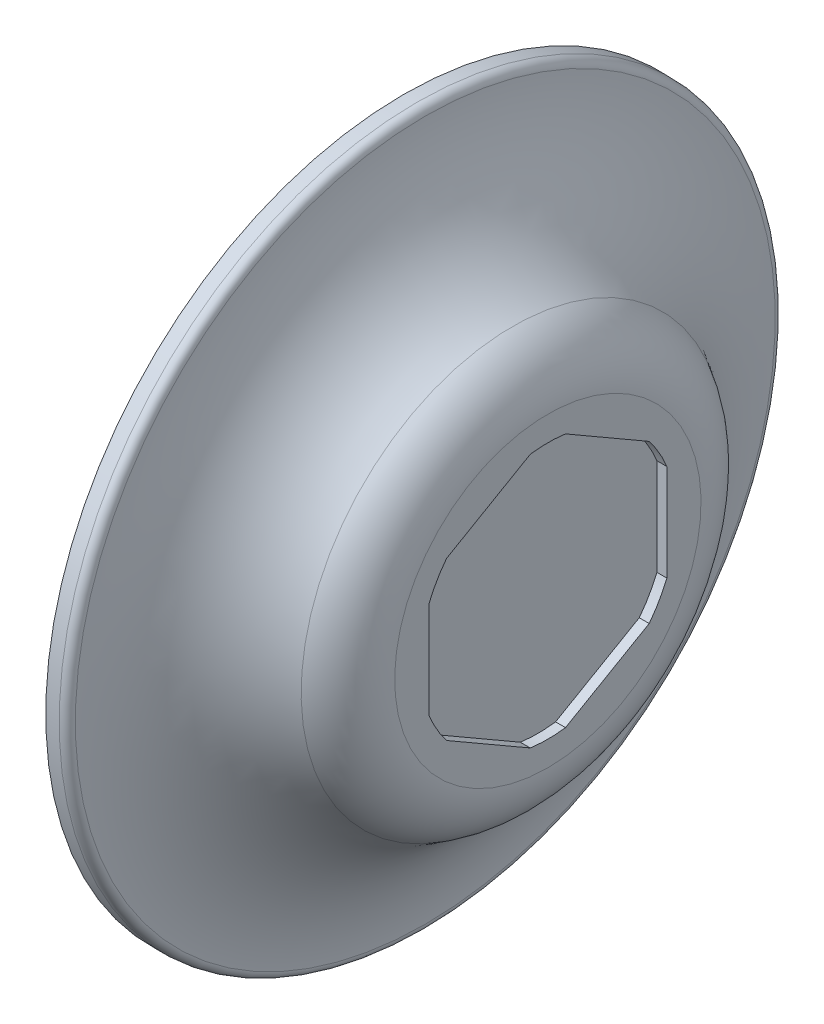
ISO-10303-21;
HEADER;
FILE_DESCRIPTION(('STEP AP214'),'2;1');
FILE_NAME('part.step','',(''),(''),'','','');
FILE_SCHEMA(('AUTOMOTIVE_DESIGN { 1 0 10303 214 1 1 1 1 }'));
ENDSEC;
DATA;
#1=APPLICATION_CONTEXT('core data for automotive mechanical design processes');
#2=APPLICATION_PROTOCOL_DEFINITION('international standard','automotive_design',2000,#1);
#3=PRODUCT_CONTEXT('',#1,'mechanical');
#4=PRODUCT('Part','Part','',(#3));
#5=PRODUCT_RELATED_PRODUCT_CATEGORY('part','',(#4));
#6=PRODUCT_DEFINITION_FORMATION('','',#4);
#7=PRODUCT_DEFINITION_CONTEXT('part definition',#1,'design');
#8=PRODUCT_DEFINITION('design','',#6,#7);
#9=PRODUCT_DEFINITION_SHAPE('','',#8);
#10=(LENGTH_UNIT() NAMED_UNIT(*) SI_UNIT(.MILLI.,.METRE.));
#11=(NAMED_UNIT(*) PLANE_ANGLE_UNIT() SI_UNIT($,.RADIAN.));
#12=(NAMED_UNIT(*) SI_UNIT($,.STERADIAN.) SOLID_ANGLE_UNIT());
#13=UNCERTAINTY_MEASURE_WITH_UNIT(LENGTH_MEASURE(1.E-05),#10,'distance_accuracy_value','');
#14=(GEOMETRIC_REPRESENTATION_CONTEXT(3) GLOBAL_UNCERTAINTY_ASSIGNED_CONTEXT((#13)) GLOBAL_UNIT_ASSIGNED_CONTEXT((#10,
#11,#12)) REPRESENTATION_CONTEXT('',''));
#15=CARTESIAN_POINT('',(0.,0.,0.));
#16=DIRECTION('',(0.,0.,1.));
#17=DIRECTION('',(1.,0.,0.));
#18=AXIS2_PLACEMENT_3D('',#15,#16,#17);
#19=CARTESIAN_POINT('',(6.94943478067401,0.,0.));
#20=DIRECTION('',(-1.,0.,0.));
#21=DIRECTION('',(0.,-1.,0.));
#22=AXIS2_PLACEMENT_3D('',#19,#20,#21);
#23=PLANE('',#22);
#24=CARTESIAN_POINT('',(6.94943478067401,0.,0.));
#25=DIRECTION('',(-1.,0.,0.));
#26=DIRECTION('',(0.,-1.,0.));
#27=AXIS2_PLACEMENT_3D('',#24,#25,#26);
#28=CIRCLE('',#27,12.2555);
#29=CARTESIAN_POINT('',(6.94943478067403,-12.2555,0.));
#30=VERTEX_POINT('',#29);
#31=EDGE_CURVE('E324',#30,#30,#28,.T.);
#32=ORIENTED_EDGE('',*,*,#31,.F.);
#33=EDGE_LOOP('',(#32));
#34=FACE_BOUND('',#33,.T.);
#35=CARTESIAN_POINT('',(6.94943478067403,0.,0.));
#36=DIRECTION('',(-1.,0.,0.));
#37=DIRECTION('',(0.,-1.,0.));
#38=AXIS2_PLACEMENT_3D('',#35,#36,#37);
#39=CIRCLE('',#38,15.5980272309643);
#40=CARTESIAN_POINT('',(6.94943478067407,-15.5980272309643,0.));
#41=VERTEX_POINT('',#40);
#42=EDGE_CURVE('E189',#41,#41,#39,.T.);
#43=ORIENTED_EDGE('',*,*,#42,.T.);
#44=EDGE_LOOP('',(#43));
#45=FACE_BOUND('',#44,.T.);
#46=ADVANCED_FACE('F34',(#34,#45),#23,.T.);
#47=CARTESIAN_POINT('',(9.413234780674,0.,0.));
#48=DIRECTION('',(-1.,0.,0.));
#49=DIRECTION('',(0.,-1.,0.));
#50=AXIS2_PLACEMENT_3D('',#47,#48,#49);
#51=PLANE('',#50);
#52=DIRECTION('',(0.,-0.500000000000011,-0.866025403784432));
#53=VECTOR('',#52,1.);
#54=CARTESIAN_POINT('',(9.41323478067401,-6.04451244070237,7.76779734572122));
#55=LINE('',#54,#53);
#56=CARTESIAN_POINT('',(9.41323478067401,-6.04451244070237,7.76779734572122));
#57=VERTEX_POINT('',#56);
#58=CARTESIAN_POINT('',(9.41323478067402,-9.74936605319513,1.35080265427886));
#59=VERTEX_POINT('',#58);
#60=EDGE_CURVE('E157',#57,#59,#55,.T.);
#61=ORIENTED_EDGE('',*,*,#60,.F.);
#62=CARTESIAN_POINT('',(9.413234780674,0.,0.));
#63=DIRECTION('',(1.,0.,0.));
#64=DIRECTION('',(0.,1.,0.));
#65=AXIS2_PLACEMENT_3D('',#62,#63,#64);
#66=CIRCLE('',#65,9.84249999999998);
#67=CARTESIAN_POINT('',(9.41323478067401,-3.70485361249268,9.1186));
#68=VERTEX_POINT('',#67);
#69=EDGE_CURVE('E49',#68,#57,#66,.T.);
#70=ORIENTED_EDGE('',*,*,#69,.F.);
#71=DIRECTION('',(0.,-1.,0.));
#72=VECTOR('',#71,1.);
#73=CARTESIAN_POINT('',(9.41323478067399,3.70485361249265,9.1186));
#74=LINE('',#73,#72);
#75=CARTESIAN_POINT('',(9.41323478067399,3.70485361249265,9.1186));
#76=VERTEX_POINT('',#75);
#77=EDGE_CURVE('E185',#76,#68,#74,.T.);
#78=ORIENTED_EDGE('',*,*,#77,.F.);
#79=CARTESIAN_POINT('',(9.413234780674,0.,0.));
#80=DIRECTION('',(1.,0.,0.));
#81=DIRECTION('',(0.,1.,0.));
#82=AXIS2_PLACEMENT_3D('',#79,#80,#81);
#83=CIRCLE('',#82,9.8425);
#84=CARTESIAN_POINT('',(9.41323478067399,6.04451244070241,7.76779734572122));
#85=VERTEX_POINT('',#84);
#86=EDGE_CURVE('E183',#85,#76,#83,.T.);
#87=ORIENTED_EDGE('',*,*,#86,.F.);
#88=DIRECTION('',(0.,0.499999999999997,-0.86602540378444));
#89=VECTOR('',#88,1.);
#90=CARTESIAN_POINT('',(9.41323478067399,6.04451244070241,7.76779734572122));
#91=LINE('',#90,#89);
#92=CARTESIAN_POINT('',(9.41323478067398,9.74936605319506,1.3508026542788));
#93=VERTEX_POINT('',#92);
#94=EDGE_CURVE('E131',#85,#93,#91,.T.);
#95=ORIENTED_EDGE('',*,*,#94,.T.);
#96=CARTESIAN_POINT('',(9.413234780674,0.,0.));
#97=DIRECTION('',(1.,0.,0.));
#98=DIRECTION('',(0.,1.,0.));
#99=AXIS2_PLACEMENT_3D('',#96,#97,#98);
#100=CIRCLE('',#99,9.84249999999996);
#101=CARTESIAN_POINT('',(9.41323478067398,9.74936605319506,-1.3508026542788));
#102=VERTEX_POINT('',#101);
#103=EDGE_CURVE('E179',#102,#93,#100,.T.);
#104=ORIENTED_EDGE('',*,*,#103,.F.);
#105=DIRECTION('',(0.,-0.499999999999997,-0.86602540378444));
#106=VECTOR('',#105,1.);
#107=CARTESIAN_POINT('',(9.41323478067398,9.74936605319506,-1.3508026542788));
#108=LINE('',#107,#106);
#109=CARTESIAN_POINT('',(9.41323478067399,6.04451244070241,-7.76779734572122));
#110=VERTEX_POINT('',#109);
#111=EDGE_CURVE('E176',#102,#110,#108,.T.);
#112=ORIENTED_EDGE('',*,*,#111,.T.);
#113=CARTESIAN_POINT('',(9.413234780674,0.,0.));
#114=DIRECTION('',(1.,0.,0.));
#115=DIRECTION('',(0.,1.,0.));
#116=AXIS2_PLACEMENT_3D('',#113,#114,#115);
#117=CIRCLE('',#116,9.8425);
#118=CARTESIAN_POINT('',(9.41323478067399,3.70485361249266,-9.1186));
#119=VERTEX_POINT('',#118);
#120=EDGE_CURVE('E173',#119,#110,#117,.T.);
#121=ORIENTED_EDGE('',*,*,#120,.F.);
#122=DIRECTION('',(0.,-1.,0.));
#123=VECTOR('',#122,1.);
#124=CARTESIAN_POINT('',(9.41323478067399,3.70485361249266,-9.1186));
#125=LINE('',#124,#123);
#126=CARTESIAN_POINT('',(9.41323478067401,-3.70485361249268,-9.11859999999998));
#127=VERTEX_POINT('',#126);
#128=EDGE_CURVE('E170',#119,#127,#125,.T.);
#129=ORIENTED_EDGE('',*,*,#128,.T.);
#130=CARTESIAN_POINT('',(9.413234780674,0.,0.));
#131=DIRECTION('',(1.,0.,0.));
#132=DIRECTION('',(0.,1.,0.));
#133=AXIS2_PLACEMENT_3D('',#130,#131,#132);
#134=CIRCLE('',#133,9.84249999999998);
#135=CARTESIAN_POINT('',(9.41323478067401,-6.04451244070237,-7.76779734572122));
#136=VERTEX_POINT('',#135);
#137=EDGE_CURVE('E167',#136,#127,#134,.T.);
#138=ORIENTED_EDGE('',*,*,#137,.F.);
#139=DIRECTION('',(0.,0.500000000000011,-0.866025403784432));
#140=VECTOR('',#139,1.);
#141=CARTESIAN_POINT('',(9.41323478067402,-9.74936605319513,-1.35080265427886));
#142=LINE('',#141,#140);
#143=CARTESIAN_POINT('',(9.41323478067402,-9.74936605319513,-1.35080265427886));
#144=VERTEX_POINT('',#143);
#145=EDGE_CURVE('E164',#144,#136,#142,.T.);
#146=ORIENTED_EDGE('',*,*,#145,.F.);
#147=CARTESIAN_POINT('',(9.413234780674,0.,0.));
#148=DIRECTION('',(1.,0.,0.));
#149=DIRECTION('',(0.,1.,0.));
#150=AXIS2_PLACEMENT_3D('',#147,#148,#149);
#151=CIRCLE('',#150,9.8425);
#152=EDGE_CURVE('E161',#59,#144,#151,.T.);
#153=ORIENTED_EDGE('',*,*,#152,.F.);
#154=EDGE_LOOP('',(#61,#70,#78,#87,#95,#104,#112,#121,#129,#138,#146,#153));
#155=FACE_BOUND('',#154,.T.);
#156=CARTESIAN_POINT('',(9.41323478067402,0.,0.));
#157=DIRECTION('',(-1.,0.,0.));
#158=DIRECTION('',(0.,-1.,0.));
#159=AXIS2_PLACEMENT_3D('',#156,#157,#158);
#160=CIRCLE('',#159,11.7436081205027);
#161=CARTESIAN_POINT('',(9.41323478067404,-11.7436081205027,0.));
#162=VERTEX_POINT('',#161);
#163=EDGE_CURVE('E221',#162,#162,#160,.T.);
#164=ORIENTED_EDGE('',*,*,#163,.F.);
#165=EDGE_LOOP('',(#164));
#166=FACE_BOUND('',#165,.T.);
#167=ADVANCED_FACE('F240',(#155,#166),#51,.F.);
#168=CARTESIAN_POINT('',(4.33323478067402,0.,0.));
#169=DIRECTION('',(-1.,0.,0.));
#170=DIRECTION('',(0.,-1.,0.));
#171=AXIS2_PLACEMENT_3D('',#168,#169,#170);
#172=TOROIDAL_SURFACE('',#171,11.7436081205027,5.08);
#173=CARTESIAN_POINT('',(6.7237391290529,0.,0.));
#174=DIRECTION('',(-1.,0.,0.));
#175=DIRECTION('',(0.,-1.,0.));
#176=AXIS2_PLACEMENT_3D('',#173,#174,#175);
#177=CIRCLE('',#176,16.2260058003591);
#178=CARTESIAN_POINT('',(6.72373912905293,-16.2260058003591,0.));
#179=VERTEX_POINT('',#178);
#180=EDGE_CURVE('E218',#179,#179,#177,.T.);
#181=ORIENTED_EDGE('',*,*,#180,.F.);
#182=EDGE_LOOP('',(#181));
#183=FACE_BOUND('',#182,.T.);
#184=ORIENTED_EDGE('',*,*,#163,.T.);
#185=EDGE_LOOP('',(#184));
#186=FACE_BOUND('',#185,.T.);
#187=ADVANCED_FACE('F245',(#183,#186),#172,.T.);
#188=CARTESIAN_POINT('',(12.7000000000001,0.,0.));
#189=DIRECTION('',(-1.,0.,0.));
#190=DIRECTION('',(0.,-1.,0.));
#191=AXIS2_PLACEMENT_3D('',#188,#189,#190);
#192=TOROIDAL_SURFACE('',#191,27.432,12.7);
#193=CARTESIAN_POINT('',(0.0144072649953912,0.,0.));
#194=DIRECTION('',(1.,0.,0.));
#195=DIRECTION('',(0.,1.,0.));
#196=AXIS2_PLACEMENT_3D('',#193,#194,#195);
#197=CIRCLE('',#196,26.8272380952384);
#198=CARTESIAN_POINT('',(0.0144072649953379,26.8272380952384,0.));
#199=VERTEX_POINT('',#198);
#200=EDGE_CURVE('E11',#199,#199,#197,.T.);
#201=ORIENTED_EDGE('',*,*,#200,.T.);
#202=EDGE_LOOP('',(#201));
#203=FACE_BOUND('',#202,.T.);
#204=ORIENTED_EDGE('',*,*,#180,.T.);
#205=EDGE_LOOP('',(#204));
#206=FACE_BOUND('',#205,.T.);
#207=ADVANCED_FACE('F253',(#203,#206),#192,.F.);
#208=CARTESIAN_POINT('',(6.94943478067398,0.,0.));
#209=DIRECTION('',(-1.,0.,0.));
#210=DIRECTION('',(0.,-1.,0.));
#211=AXIS2_PLACEMENT_3D('',#208,#209,#210);
#212=CYLINDRICAL_SURFACE('',#211,27.432);
#213=CARTESIAN_POINT('',(-0.619872371760822,0.,0.));
#214=DIRECTION('',(1.,0.,0.));
#215=DIRECTION('',(0.,1.,0.));
#216=AXIS2_PLACEMENT_3D('',#213,#214,#215);
#217=CIRCLE('',#216,27.432);
#218=CARTESIAN_POINT('',(-0.619872371760877,27.432,0.));
#219=VERTEX_POINT('',#218);
#220=EDGE_CURVE('E42',#219,#219,#217,.F.);
#221=ORIENTED_EDGE('',*,*,#220,.T.);
#222=EDGE_LOOP('',(#221));
#223=FACE_BOUND('',#222,.T.);
#224=CARTESIAN_POINT('',(-1.6509999999999,0.,0.));
#225=DIRECTION('',(-1.,0.,0.));
#226=DIRECTION('',(0.,-1.,0.));
#227=AXIS2_PLACEMENT_3D('',#224,#225,#226);
#228=CIRCLE('',#227,27.432);
#229=CARTESIAN_POINT('',(-1.65099999999984,-27.4320000000001,0.));
#230=VERTEX_POINT('',#229);
#231=EDGE_CURVE('E215',#230,#230,#228,.T.);
#232=ORIENTED_EDGE('',*,*,#231,.F.);
#233=EDGE_LOOP('',(#232));
#234=FACE_BOUND('',#233,.T.);
#235=ADVANCED_FACE('F226',(#223,#234),#212,.T.);
#236=CARTESIAN_POINT('',(-1.65099999999995,27.432,0.));
#237=DIRECTION('',(1.,0.,0.));
#238=DIRECTION('',(0.,1.,0.));
#239=AXIS2_PLACEMENT_3D('',#236,#237,#238);
#240=PLANE('',#239);
#241=CARTESIAN_POINT('',(-1.6509999999999,0.,0.));
#242=DIRECTION('',(-1.,0.,0.));
#243=DIRECTION('',(0.,-1.,0.));
#244=AXIS2_PLACEMENT_3D('',#241,#242,#243);
#245=CIRCLE('',#244,26.162);
#246=CARTESIAN_POINT('',(-1.65099999999985,-26.1620000000001,0.));
#247=VERTEX_POINT('',#246);
#248=EDGE_CURVE('E212',#247,#247,#245,.T.);
#249=ORIENTED_EDGE('',*,*,#248,.F.);
#250=EDGE_LOOP('',(#249));
#251=FACE_BOUND('',#250,.T.);
#252=ORIENTED_EDGE('',*,*,#231,.T.);
#253=EDGE_LOOP('',(#252));
#254=FACE_BOUND('',#253,.T.);
#255=ADVANCED_FACE('F260',(#251,#254),#240,.F.);
#256=CARTESIAN_POINT('',(6.94943478067398,0.,0.));
#257=DIRECTION('',(-1.,0.,0.));
#258=DIRECTION('',(0.,-1.,0.));
#259=AXIS2_PLACEMENT_3D('',#256,#257,#258);
#260=CYLINDRICAL_SURFACE('',#259,26.162);
#261=CARTESIAN_POINT('',(-0.395763125530236,0.,0.));
#262=DIRECTION('',(-1.,0.,0.));
#263=DIRECTION('',(0.,-1.,0.));
#264=AXIS2_PLACEMENT_3D('',#261,#262,#263);
#265=CIRCLE('',#264,26.162);
#266=CARTESIAN_POINT('',(-0.395763125530184,-26.1620000000001,0.));
#267=VERTEX_POINT('',#266);
#268=EDGE_CURVE('E209',#267,#267,#265,.T.);
#269=ORIENTED_EDGE('',*,*,#268,.F.);
#270=EDGE_LOOP('',(#269));
#271=FACE_BOUND('',#270,.T.);
#272=ORIENTED_EDGE('',*,*,#248,.T.);
#273=EDGE_LOOP('',(#272));
#274=FACE_BOUND('',#273,.T.);
#275=ADVANCED_FACE('F263',(#271,#274),#260,.F.);
#276=CARTESIAN_POINT('',(12.7000000000001,0.,0.));
#277=DIRECTION('',(-1.,0.,0.));
#278=DIRECTION('',(0.,-1.,0.));
#279=AXIS2_PLACEMENT_3D('',#276,#277,#278);
#280=TOROIDAL_SURFACE('',#279,27.432,13.1572);
#281=ORIENTED_EDGE('',*,*,#42,.F.);
#282=EDGE_LOOP('',(#281));
#283=FACE_BOUND('',#282,.T.);
#284=ORIENTED_EDGE('',*,*,#268,.T.);
#285=EDGE_LOOP('',(#284));
#286=FACE_BOUND('',#285,.T.);
#287=ADVANCED_FACE('F267',(#283,#286),#280,.T.);
#288=CARTESIAN_POINT('',(8.651234780674,0.,0.));
#289=DIRECTION('',(1.,0.,0.));
#290=DIRECTION('',(0.,1.,0.));
#291=AXIS2_PLACEMENT_3D('',#288,#289,#290);
#292=CYLINDRICAL_SURFACE('',#291,9.84249999999998);
#293=ORIENTED_EDGE('',*,*,#69,.T.);
#294=DIRECTION('',(1.,0.,0.));
#295=VECTOR('',#294,1.);
#296=CARTESIAN_POINT('',(8.65123478067401,-6.04451244070238,7.76779734572122));
#297=LINE('',#296,#295);
#298=CARTESIAN_POINT('',(8.65123478067401,-6.04451244070238,7.76779734572122));
#299=VERTEX_POINT('',#298);
#300=EDGE_CURVE('E97',#299,#57,#297,.T.);
#301=ORIENTED_EDGE('',*,*,#300,.F.);
#302=CARTESIAN_POINT('',(8.651234780674,0.,0.));
#303=DIRECTION('',(1.,0.,0.));
#304=DIRECTION('',(0.,1.,0.));
#305=AXIS2_PLACEMENT_3D('',#302,#303,#304);
#306=CIRCLE('',#305,9.84249999999998);
#307=CARTESIAN_POINT('',(8.65123478067401,-3.70485361249268,9.1186));
#308=VERTEX_POINT('',#307);
#309=EDGE_CURVE('E187',#308,#299,#306,.T.);
#310=ORIENTED_EDGE('',*,*,#309,.F.);
#311=DIRECTION('',(1.,0.,0.));
#312=VECTOR('',#311,1.);
#313=CARTESIAN_POINT('',(8.65123478067401,-3.70485361249268,9.1186));
#314=LINE('',#313,#312);
#315=EDGE_CURVE('E57',#308,#68,#314,.T.);
#316=ORIENTED_EDGE('',*,*,#315,.T.);
#317=EDGE_LOOP('',(#293,#301,#310,#316));
#318=FACE_BOUND('',#317,.T.);
#319=ADVANCED_FACE('F271',(#318),#292,.F.);
#320=CARTESIAN_POINT('',(8.65123478067399,3.70485361249265,9.1186));
#321=DIRECTION('',(0.,0.,1.));
#322=DIRECTION('',(1.,0.,0.));
#323=AXIS2_PLACEMENT_3D('',#320,#321,#322);
#324=PLANE('',#323);
#325=ORIENTED_EDGE('',*,*,#77,.T.);
#326=ORIENTED_EDGE('',*,*,#315,.F.);
#327=DIRECTION('',(0.,-1.,0.));
#328=VECTOR('',#327,1.);
#329=CARTESIAN_POINT('',(8.65123478067399,3.70485361249265,9.1186));
#330=LINE('',#329,#328);
#331=CARTESIAN_POINT('',(8.65123478067399,3.70485361249265,9.1186));
#332=VERTEX_POINT('',#331);
#333=EDGE_CURVE('E151',#332,#308,#330,.T.);
#334=ORIENTED_EDGE('',*,*,#333,.F.);
#335=DIRECTION('',(1.,0.,0.));
#336=VECTOR('',#335,1.);
#337=CARTESIAN_POINT('',(8.65123478067399,3.70485361249265,9.1186));
#338=LINE('',#337,#336);
#339=EDGE_CURVE('E136',#332,#76,#338,.T.);
#340=ORIENTED_EDGE('',*,*,#339,.T.);
#341=EDGE_LOOP('',(#325,#326,#334,#340));
#342=FACE_BOUND('',#341,.T.);
#343=ADVANCED_FACE('F275',(#342),#324,.F.);
#344=CARTESIAN_POINT('',(8.651234780674,0.,0.));
#345=DIRECTION('',(1.,0.,0.));
#346=DIRECTION('',(0.,1.,0.));
#347=AXIS2_PLACEMENT_3D('',#344,#345,#346);
#348=CYLINDRICAL_SURFACE('',#347,9.8425);
#349=ORIENTED_EDGE('',*,*,#86,.T.);
#350=ORIENTED_EDGE('',*,*,#339,.F.);
#351=CARTESIAN_POINT('',(8.651234780674,0.,0.));
#352=DIRECTION('',(1.,0.,0.));
#353=DIRECTION('',(0.,1.,0.));
#354=AXIS2_PLACEMENT_3D('',#351,#352,#353);
#355=CIRCLE('',#354,9.8425);
#356=CARTESIAN_POINT('',(8.65123478067399,6.04451244070241,7.76779734572122));
#357=VERTEX_POINT('',#356);
#358=EDGE_CURVE('E145',#357,#332,#355,.T.);
#359=ORIENTED_EDGE('',*,*,#358,.F.);
#360=DIRECTION('',(1.,0.,0.));
#361=VECTOR('',#360,1.);
#362=CARTESIAN_POINT('',(8.65123478067399,6.04451244070241,7.76779734572122));
#363=LINE('',#362,#361);
#364=EDGE_CURVE('E125',#357,#85,#363,.T.);
#365=ORIENTED_EDGE('',*,*,#364,.T.);
#366=EDGE_LOOP('',(#349,#350,#359,#365));
#367=FACE_BOUND('',#366,.T.);
#368=ADVANCED_FACE('F150',(#367),#348,.F.);
#369=CARTESIAN_POINT('',(8.65123478067399,6.04451244070241,7.76779734572122));
#370=DIRECTION('',(0.,-0.86602540378444,-0.499999999999997));
#371=DIRECTION('',(0.,0.499999999999997,-0.86602540378444));
#372=AXIS2_PLACEMENT_3D('',#369,#370,#371);
#373=PLANE('',#372);
#374=ORIENTED_EDGE('',*,*,#94,.F.);
#375=ORIENTED_EDGE('',*,*,#364,.F.);
#376=DIRECTION('',(0.,0.499999999999997,-0.86602540378444));
#377=VECTOR('',#376,1.);
#378=CARTESIAN_POINT('',(8.65123478067399,6.04451244070241,7.76779734572122));
#379=LINE('',#378,#377);
#380=CARTESIAN_POINT('',(8.65123478067398,9.74936605319506,1.3508026542788));
#381=VERTEX_POINT('',#380);
#382=EDGE_CURVE('E128',#357,#381,#379,.T.);
#383=ORIENTED_EDGE('',*,*,#382,.T.);
#384=DIRECTION('',(1.,0.,0.));
#385=VECTOR('',#384,1.);
#386=CARTESIAN_POINT('',(8.65123478067398,9.74936605319506,1.3508026542788));
#387=LINE('',#386,#385);
#388=EDGE_CURVE('E137',#381,#93,#387,.T.);
#389=ORIENTED_EDGE('',*,*,#388,.T.);
#390=EDGE_LOOP('',(#374,#375,#383,#389));
#391=FACE_BOUND('',#390,.T.);
#392=ADVANCED_FACE('F127',(#391),#373,.T.);
#393=CARTESIAN_POINT('',(8.651234780674,0.,0.));
#394=DIRECTION('',(1.,0.,0.));
#395=DIRECTION('',(0.,1.,0.));
#396=AXIS2_PLACEMENT_3D('',#393,#394,#395);
#397=CYLINDRICAL_SURFACE('',#396,9.84249999999996);
#398=ORIENTED_EDGE('',*,*,#103,.T.);
#399=ORIENTED_EDGE('',*,*,#388,.F.);
#400=CARTESIAN_POINT('',(8.651234780674,0.,0.));
#401=DIRECTION('',(1.,0.,0.));
#402=DIRECTION('',(0.,1.,0.));
#403=AXIS2_PLACEMENT_3D('',#400,#401,#402);
#404=CIRCLE('',#403,9.84249999999996);
#405=CARTESIAN_POINT('',(8.65123478067398,9.74936605319506,-1.3508026542788));
#406=VERTEX_POINT('',#405);
#407=EDGE_CURVE('E148',#406,#381,#404,.T.);
#408=ORIENTED_EDGE('',*,*,#407,.F.);
#409=DIRECTION('',(1.,0.,0.));
#410=VECTOR('',#409,1.);
#411=CARTESIAN_POINT('',(8.65123478067398,9.74936605319506,-1.3508026542788));
#412=LINE('',#411,#410);
#413=EDGE_CURVE('E192',#406,#102,#412,.T.);
#414=ORIENTED_EDGE('',*,*,#413,.T.);
#415=EDGE_LOOP('',(#398,#399,#408,#414));
#416=FACE_BOUND('',#415,.T.);
#417=ADVANCED_FACE('F303',(#416),#397,.F.);
#418=CARTESIAN_POINT('',(8.65123478067398,9.74936605319506,-1.3508026542788));
#419=DIRECTION('',(0.,-0.86602540378444,0.499999999999997));
#420=DIRECTION('',(0.,-0.499999999999997,-0.86602540378444));
#421=AXIS2_PLACEMENT_3D('',#418,#419,#420);
#422=PLANE('',#421);
#423=ORIENTED_EDGE('',*,*,#111,.F.);
#424=ORIENTED_EDGE('',*,*,#413,.F.);
#425=DIRECTION('',(0.,-0.499999999999997,-0.86602540378444));
#426=VECTOR('',#425,1.);
#427=CARTESIAN_POINT('',(8.65123478067398,9.74936605319506,-1.3508026542788));
#428=LINE('',#427,#426);
#429=CARTESIAN_POINT('',(8.65123478067399,6.04451244070241,-7.76779734572122));
#430=VERTEX_POINT('',#429);
#431=EDGE_CURVE('E346',#406,#430,#428,.T.);
#432=ORIENTED_EDGE('',*,*,#431,.T.);
#433=DIRECTION('',(1.,0.,0.));
#434=VECTOR('',#433,1.);
#435=CARTESIAN_POINT('',(8.65123478067399,6.04451244070241,-7.76779734572122));
#436=LINE('',#435,#434);
#437=EDGE_CURVE('E194',#430,#110,#436,.T.);
#438=ORIENTED_EDGE('',*,*,#437,.T.);
#439=EDGE_LOOP('',(#423,#424,#432,#438));
#440=FACE_BOUND('',#439,.T.);
#441=ADVANCED_FACE('F299',(#440),#422,.T.);
#442=CARTESIAN_POINT('',(8.651234780674,0.,0.));
#443=DIRECTION('',(1.,0.,0.));
#444=DIRECTION('',(0.,1.,0.));
#445=AXIS2_PLACEMENT_3D('',#442,#443,#444);
#446=CYLINDRICAL_SURFACE('',#445,9.8425);
#447=ORIENTED_EDGE('',*,*,#120,.T.);
#448=ORIENTED_EDGE('',*,*,#437,.F.);
#449=CARTESIAN_POINT('',(8.651234780674,0.,0.));
#450=DIRECTION('',(1.,0.,0.));
#451=DIRECTION('',(0.,1.,0.));
#452=AXIS2_PLACEMENT_3D('',#449,#450,#451);
#453=CIRCLE('',#452,9.8425);
#454=CARTESIAN_POINT('',(8.65123478067399,3.70485361249266,-9.1186));
#455=VERTEX_POINT('',#454);
#456=EDGE_CURVE('E343',#455,#430,#453,.T.);
#457=ORIENTED_EDGE('',*,*,#456,.F.);
#458=DIRECTION('',(1.,0.,0.));
#459=VECTOR('',#458,1.);
#460=CARTESIAN_POINT('',(8.65123478067399,3.70485361249266,-9.1186));
#461=LINE('',#460,#459);
#462=EDGE_CURVE('E196',#455,#119,#461,.T.);
#463=ORIENTED_EDGE('',*,*,#462,.T.);
#464=EDGE_LOOP('',(#447,#448,#457,#463));
#465=FACE_BOUND('',#464,.T.);
#466=ADVANCED_FACE('F295',(#465),#446,.F.);
#467=CARTESIAN_POINT('',(8.65123478067399,3.70485361249266,-9.1186));
#468=DIRECTION('',(0.,0.,1.));
#469=DIRECTION('',(1.,0.,0.));
#470=AXIS2_PLACEMENT_3D('',#467,#468,#469);
#471=PLANE('',#470);
#472=ORIENTED_EDGE('',*,*,#128,.F.);
#473=ORIENTED_EDGE('',*,*,#462,.F.);
#474=DIRECTION('',(0.,-1.,0.));
#475=VECTOR('',#474,1.);
#476=CARTESIAN_POINT('',(8.65123478067399,3.70485361249266,-9.1186));
#477=LINE('',#476,#475);
#478=CARTESIAN_POINT('',(8.65123478067401,-3.70485361249269,-9.11859999999998));
#479=VERTEX_POINT('',#478);
#480=EDGE_CURVE('E341',#455,#479,#477,.T.);
#481=ORIENTED_EDGE('',*,*,#480,.T.);
#482=DIRECTION('',(1.,0.,0.));
#483=VECTOR('',#482,1.);
#484=CARTESIAN_POINT('',(8.65123478067401,-3.70485361249269,-9.11859999999998));
#485=LINE('',#484,#483);
#486=EDGE_CURVE('E198',#479,#127,#485,.T.);
#487=ORIENTED_EDGE('',*,*,#486,.T.);
#488=EDGE_LOOP('',(#472,#473,#481,#487));
#489=FACE_BOUND('',#488,.T.);
#490=ADVANCED_FACE('F291',(#489),#471,.T.);
#491=CARTESIAN_POINT('',(8.651234780674,0.,0.));
#492=DIRECTION('',(1.,0.,0.));
#493=DIRECTION('',(0.,1.,0.));
#494=AXIS2_PLACEMENT_3D('',#491,#492,#493);
#495=CYLINDRICAL_SURFACE('',#494,9.84249999999998);
#496=ORIENTED_EDGE('',*,*,#137,.T.);
#497=ORIENTED_EDGE('',*,*,#486,.F.);
#498=CARTESIAN_POINT('',(8.651234780674,0.,0.));
#499=DIRECTION('',(1.,0.,0.));
#500=DIRECTION('',(0.,1.,0.));
#501=AXIS2_PLACEMENT_3D('',#498,#499,#500);
#502=CIRCLE('',#501,9.84249999999998);
#503=CARTESIAN_POINT('',(8.65123478067401,-6.04451244070237,-7.76779734572122));
#504=VERTEX_POINT('',#503);
#505=EDGE_CURVE('E338',#504,#479,#502,.T.);
#506=ORIENTED_EDGE('',*,*,#505,.F.);
#507=DIRECTION('',(1.,0.,0.));
#508=VECTOR('',#507,1.);
#509=CARTESIAN_POINT('',(8.65123478067401,-6.04451244070237,-7.76779734572122));
#510=LINE('',#509,#508);
#511=EDGE_CURVE('E200',#504,#136,#510,.T.);
#512=ORIENTED_EDGE('',*,*,#511,.T.);
#513=EDGE_LOOP('',(#496,#497,#506,#512));
#514=FACE_BOUND('',#513,.T.);
#515=ADVANCED_FACE('F287',(#514),#495,.F.);
#516=CARTESIAN_POINT('',(8.65123478067402,-9.74936605319513,-1.35080265427886));
#517=DIRECTION('',(0.,-0.866025403784432,-0.500000000000011));
#518=DIRECTION('',(0.,0.500000000000012,-0.866025403784432));
#519=AXIS2_PLACEMENT_3D('',#516,#517,#518);
#520=PLANE('',#519);
#521=ORIENTED_EDGE('',*,*,#145,.T.);
#522=ORIENTED_EDGE('',*,*,#511,.F.);
#523=DIRECTION('',(0.,0.500000000000011,-0.866025403784432));
#524=VECTOR('',#523,1.);
#525=CARTESIAN_POINT('',(8.65123478067402,-9.74936605319513,-1.35080265427886));
#526=LINE('',#525,#524);
#527=CARTESIAN_POINT('',(8.65123478067402,-9.74936605319513,-1.35080265427886));
#528=VERTEX_POINT('',#527);
#529=EDGE_CURVE('E335',#528,#504,#526,.T.);
#530=ORIENTED_EDGE('',*,*,#529,.F.);
#531=DIRECTION('',(1.,0.,0.));
#532=VECTOR('',#531,1.);
#533=CARTESIAN_POINT('',(8.65123478067402,-9.74936605319513,-1.35080265427886));
#534=LINE('',#533,#532);
#535=EDGE_CURVE('E202',#528,#144,#534,.T.);
#536=ORIENTED_EDGE('',*,*,#535,.T.);
#537=EDGE_LOOP('',(#521,#522,#530,#536));
#538=FACE_BOUND('',#537,.T.);
#539=ADVANCED_FACE('F283',(#538),#520,.F.);
#540=CARTESIAN_POINT('',(8.651234780674,0.,0.));
#541=DIRECTION('',(1.,0.,0.));
#542=DIRECTION('',(0.,1.,0.));
#543=AXIS2_PLACEMENT_3D('',#540,#541,#542);
#544=CYLINDRICAL_SURFACE('',#543,9.8425);
#545=ORIENTED_EDGE('',*,*,#152,.T.);
#546=ORIENTED_EDGE('',*,*,#535,.F.);
#547=CARTESIAN_POINT('',(8.651234780674,0.,0.));
#548=DIRECTION('',(1.,0.,0.));
#549=DIRECTION('',(0.,1.,0.));
#550=AXIS2_PLACEMENT_3D('',#547,#548,#549);
#551=CIRCLE('',#550,9.8425);
#552=CARTESIAN_POINT('',(8.65123478067402,-9.74936605319513,1.35080265427886));
#553=VERTEX_POINT('',#552);
#554=EDGE_CURVE('E332',#553,#528,#551,.T.);
#555=ORIENTED_EDGE('',*,*,#554,.F.);
#556=DIRECTION('',(1.,0.,0.));
#557=VECTOR('',#556,1.);
#558=CARTESIAN_POINT('',(8.65123478067402,-9.74936605319513,1.35080265427886));
#559=LINE('',#558,#557);
#560=EDGE_CURVE('E204',#553,#59,#559,.T.);
#561=ORIENTED_EDGE('',*,*,#560,.T.);
#562=EDGE_LOOP('',(#545,#546,#555,#561));
#563=FACE_BOUND('',#562,.T.);
#564=ADVANCED_FACE('F279',(#563),#544,.F.);
#565=CARTESIAN_POINT('',(8.65123478067401,-6.04451244070238,7.76779734572122));
#566=DIRECTION('',(0.,-0.866025403784432,0.500000000000011));
#567=DIRECTION('',(0.,-0.500000000000011,-0.866025403784432));
#568=AXIS2_PLACEMENT_3D('',#565,#566,#567);
#569=PLANE('',#568);
#570=ORIENTED_EDGE('',*,*,#60,.T.);
#571=ORIENTED_EDGE('',*,*,#560,.F.);
#572=DIRECTION('',(0.,-0.500000000000011,-0.866025403784432));
#573=VECTOR('',#572,1.);
#574=CARTESIAN_POINT('',(8.65123478067401,-6.04451244070238,7.76779734572122));
#575=LINE('',#574,#573);
#576=EDGE_CURVE('E329',#299,#553,#575,.T.);
#577=ORIENTED_EDGE('',*,*,#576,.F.);
#578=ORIENTED_EDGE('',*,*,#300,.T.);
#579=EDGE_LOOP('',(#570,#571,#577,#578));
#580=FACE_BOUND('',#579,.T.);
#581=ADVANCED_FACE('F276',(#580),#569,.F.);
#582=CARTESIAN_POINT('',(8.651234780674,0.,0.));
#583=DIRECTION('',(1.,0.,0.));
#584=DIRECTION('',(0.,1.,0.));
#585=AXIS2_PLACEMENT_3D('',#582,#583,#584);
#586=PLANE('',#585);
#587=ORIENTED_EDGE('',*,*,#309,.T.);
#588=ORIENTED_EDGE('',*,*,#576,.T.);
#589=ORIENTED_EDGE('',*,*,#554,.T.);
#590=ORIENTED_EDGE('',*,*,#529,.T.);
#591=ORIENTED_EDGE('',*,*,#505,.T.);
#592=ORIENTED_EDGE('',*,*,#480,.F.);
#593=ORIENTED_EDGE('',*,*,#456,.T.);
#594=ORIENTED_EDGE('',*,*,#431,.F.);
#595=ORIENTED_EDGE('',*,*,#407,.T.);
#596=ORIENTED_EDGE('',*,*,#382,.F.);
#597=ORIENTED_EDGE('',*,*,#358,.T.);
#598=ORIENTED_EDGE('',*,*,#333,.T.);
#599=EDGE_LOOP('',(#587,#588,#589,#590,#591,#592,#593,#594,#595,#596,#597,#598));
#600=FACE_BOUND('',#599,.T.);
#601=ADVANCED_FACE('F143',(#600),#586,.T.);
#602=CARTESIAN_POINT('',(7.69873478067401,0.,0.));
#603=DIRECTION('',(-1.,0.,0.));
#604=DIRECTION('',(0.,-1.,0.));
#605=AXIS2_PLACEMENT_3D('',#602,#603,#604);
#606=CYLINDRICAL_SURFACE('',#605,12.2555);
#607=CARTESIAN_POINT('',(7.69873478067401,0.,0.));
#608=DIRECTION('',(-1.,0.,0.));
#609=DIRECTION('',(0.,-1.,0.));
#610=AXIS2_PLACEMENT_3D('',#607,#608,#609);
#611=CIRCLE('',#610,12.2555);
#612=CARTESIAN_POINT('',(7.69873478067403,-12.2555,0.));
#613=VERTEX_POINT('',#612);
#614=EDGE_CURVE('E158',#613,#613,#611,.T.);
#615=CARTESIAN_POINT('',(7.69873478067403,-12.2555,0.));
#616=CARTESIAN_POINT('',(7.6909295723407,-12.2555,0.));
#617=CARTESIAN_POINT('',(7.68312436400736,-12.2555,0.));
#618=CARTESIAN_POINT('',(7.6675139473407,-12.2555,0.));
#619=CARTESIAN_POINT('',(7.65970873900736,-12.2555,0.));
#620=CARTESIAN_POINT('',(7.6440983223407,-12.2555,0.));
#621=CARTESIAN_POINT('',(7.63629311400736,-12.2555,0.));
#622=CARTESIAN_POINT('',(7.6206826973407,-12.2555,0.));
#623=CARTESIAN_POINT('',(7.61287748900736,-12.2555,0.));
#624=CARTESIAN_POINT('',(7.5972670723407,-12.2555,0.));
#625=CARTESIAN_POINT('',(7.58946186400736,-12.2555,0.));
#626=CARTESIAN_POINT('',(7.5738514473407,-12.2555,0.));
#627=CARTESIAN_POINT('',(7.56604623900736,-12.2555,0.));
#628=CARTESIAN_POINT('',(7.5504358223407,-12.2555,0.));
#629=CARTESIAN_POINT('',(7.54263061400736,-12.2555,0.));
#630=CARTESIAN_POINT('',(7.5270201973407,-12.2555,0.));
#631=CARTESIAN_POINT('',(7.51921498900736,-12.2555,0.));
#632=CARTESIAN_POINT('',(7.5036045723407,-12.2555,0.));
#633=CARTESIAN_POINT('',(7.49579936400736,-12.2555,0.));
#634=CARTESIAN_POINT('',(7.4801889473407,-12.2555,0.));
#635=CARTESIAN_POINT('',(7.47238373900736,-12.2555,0.));
#636=CARTESIAN_POINT('',(7.4567733223407,-12.2555,0.));
#637=CARTESIAN_POINT('',(7.44896811400736,-12.2555,0.));
#638=CARTESIAN_POINT('',(7.4333576973407,-12.2555,0.));
#639=CARTESIAN_POINT('',(7.42555248900736,-12.2555,0.));
#640=CARTESIAN_POINT('',(7.4099420723407,-12.2555,0.));
#641=CARTESIAN_POINT('',(7.40213686400736,-12.2555,0.));
#642=CARTESIAN_POINT('',(7.3865264473407,-12.2555,0.));
#643=CARTESIAN_POINT('',(7.37872123900736,-12.2555,0.));
#644=CARTESIAN_POINT('',(7.3631108223407,-12.2555,0.));
#645=CARTESIAN_POINT('',(7.35530561400736,-12.2555,0.));
#646=CARTESIAN_POINT('',(7.3396951973407,-12.2555,0.));
#647=CARTESIAN_POINT('',(7.33188998900736,-12.2555,0.));
#648=CARTESIAN_POINT('',(7.3162795723407,-12.2555,0.));
#649=CARTESIAN_POINT('',(7.30847436400736,-12.2555,0.));
#650=CARTESIAN_POINT('',(7.2928639473407,-12.2555,0.));
#651=CARTESIAN_POINT('',(7.28505873900736,-12.2555,0.));
#652=CARTESIAN_POINT('',(7.2694483223407,-12.2555,0.));
#653=CARTESIAN_POINT('',(7.26164311400736,-12.2555,0.));
#654=CARTESIAN_POINT('',(7.2460326973407,-12.2555,0.));
#655=CARTESIAN_POINT('',(7.23822748900736,-12.2555,0.));
#656=CARTESIAN_POINT('',(7.2226170723407,-12.2555,0.));
#657=CARTESIAN_POINT('',(7.21481186400736,-12.2555,0.));
#658=CARTESIAN_POINT('',(7.1992014473407,-12.2555,0.));
#659=CARTESIAN_POINT('',(7.19139623900736,-12.2555,0.));
#660=CARTESIAN_POINT('',(7.1757858223407,-12.2555,0.));
#661=CARTESIAN_POINT('',(7.16798061400736,-12.2555,0.));
#662=CARTESIAN_POINT('',(7.1523701973407,-12.2555,0.));
#663=CARTESIAN_POINT('',(7.14456498900736,-12.2555,0.));
#664=CARTESIAN_POINT('',(7.1289545723407,-12.2555,0.));
#665=CARTESIAN_POINT('',(7.12114936400736,-12.2555,0.));
#666=CARTESIAN_POINT('',(7.1055389473407,-12.2555,0.));
#667=CARTESIAN_POINT('',(7.09773373900736,-12.2555,0.));
#668=CARTESIAN_POINT('',(7.0821233223407,-12.2555,0.));
#669=CARTESIAN_POINT('',(7.07431811400736,-12.2555,0.));
#670=CARTESIAN_POINT('',(7.0587076973407,-12.2555,0.));
#671=CARTESIAN_POINT('',(7.05090248900736,-12.2555,0.));
#672=CARTESIAN_POINT('',(7.0352920723407,-12.2555,0.));
#673=CARTESIAN_POINT('',(7.02748686400736,-12.2555,0.));
#674=CARTESIAN_POINT('',(7.0118764473407,-12.2555,0.));
#675=CARTESIAN_POINT('',(7.00407123900736,-12.2555,0.));
#676=CARTESIAN_POINT('',(6.9884608223407,-12.2555,0.));
#677=CARTESIAN_POINT('',(6.98065561400736,-12.2555,0.));
#678=CARTESIAN_POINT('',(6.9650451973407,-12.2555,0.));
#679=CARTESIAN_POINT('',(6.95723998900736,-12.2555,0.));
#680=CARTESIAN_POINT('',(6.94943478067403,-12.2555,0.));
#681=B_SPLINE_CURVE_WITH_KNOTS('',3,(#615,#616,#617,#618,#619,#620,#621,#622,#623,#624,#625,
#626,#627,#628,#629,#630,#631,#632,#633,#634,#635,#636,#637,#638,#639,#640,#641,#642,#643,#644,
#645,#646,#647,#648,#649,#650,#651,#652,#653,#654,#655,#656,#657,#658,#659,#660,#661,#662,#663,
#664,#665,#666,#667,#668,#669,#670,#671,#672,#673,#674,#675,#676,#677,#678,#679,#680),
.UNSPECIFIED.,.F.,.F.,(4,2,2,2,2,2,2,2,2,2,2,2,2,2,2,2,2,2,2,2,2,2,2,2,2,2,2,2,2,2,2,2,4),(0.,
0.0234156249999994,0.0468312499999997,0.0702468749999999,0.0936624999999993,0.117078125,
0.14049375,0.163909374999999,0.187324999999999,0.210740625,0.234156249999999,0.257571874999999,
0.2809875,0.304403124999999,0.327818749999999,0.351234375,0.374649999999999,0.398065624999999,
0.421481249999999,0.444896875,0.468312499999999,0.491728124999999,0.515143749999999,
0.538559374999999,0.561974999999999,0.585390624999999,0.608806249999999,0.632221874999999,
0.655637499999999,0.679053124999999,0.702468749999999,0.725884374999999,0.749299999999999),.UNSPECIFIED.);
#682=EDGE_CURVE('BSEAM235',#613,#30,#681,.T.);
#683=ORIENTED_EDGE('',*,*,#614,.F.);
#684=ORIENTED_EDGE('',*,*,#31,.T.);
#685=ORIENTED_EDGE('',*,*,#682,.T.);
#686=ORIENTED_EDGE('',*,*,#682,.F.);
#687=EDGE_LOOP('',(#683,#685,#684,#686));
#688=FACE_BOUND('',#687,.T.);
#689=ADVANCED_FACE('F235',(#688),#606,.F.);
#690=CARTESIAN_POINT('',(7.69873478067401,0.,0.));
#691=DIRECTION('',(-1.,0.,0.));
#692=DIRECTION('',(0.,-1.,0.));
#693=AXIS2_PLACEMENT_3D('',#690,#691,#692);
#694=PLANE('',#693);
#695=ORIENTED_EDGE('',*,*,#614,.T.);
#696=EDGE_LOOP('',(#695));
#697=FACE_BOUND('',#696,.T.);
#698=ADVANCED_FACE('F230',(#697),#694,.T.);
#699=CARTESIAN_POINT('',(-0.619872371760822,0.,0.));
#700=DIRECTION('',(1.,0.,0.));
#701=DIRECTION('',(0.,1.,0.));
#702=AXIS2_PLACEMENT_3D('',#699,#700,#701);
#703=TOROIDAL_SURFACE('',#702,26.797,0.635);
#704=ORIENTED_EDGE('',*,*,#200,.F.);
#705=EDGE_LOOP('',(#704));
#706=FACE_BOUND('',#705,.T.);
#707=ORIENTED_EDGE('',*,*,#220,.F.);
#708=EDGE_LOOP('',(#707));
#709=FACE_BOUND('',#708,.T.);
#710=ADVANCED_FACE('F36',(#706,#709),#703,.T.);
#711=CLOSED_SHELL('',(#46,#167,#187,#207,#235,#255,#275,#287,#319,#343,#368,#392,#417,#441,#466,
#490,#515,#539,#564,#581,#601,#689,#698,#710));
#712=MANIFOLD_SOLID_BREP('B2',#711);
#713=ADVANCED_BREP_SHAPE_REPRESENTATION('',(#18,#712),#14);
#714=SHAPE_DEFINITION_REPRESENTATION(#9,#713);
ENDSEC;
END-ISO-10303-21;
